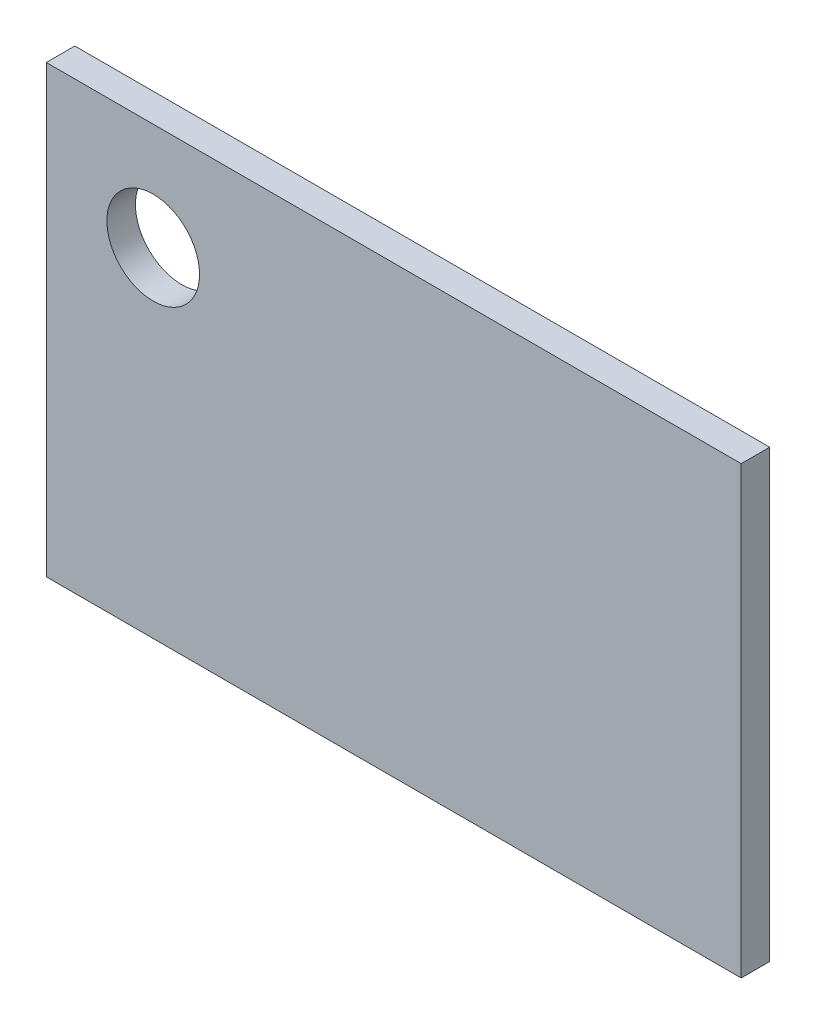
ISO-10303-21;
HEADER;
FILE_DESCRIPTION(('STEP AP214'),'2;1');
FILE_NAME('part.step','',(''),(''),'','','');
FILE_SCHEMA(('AUTOMOTIVE_DESIGN { 1 0 10303 214 1 1 1 1 }'));
ENDSEC;
DATA;
#1=APPLICATION_CONTEXT('core data for automotive mechanical design processes');
#2=APPLICATION_PROTOCOL_DEFINITION('international standard','automotive_design',2000,#1);
#3=PRODUCT_CONTEXT('',#1,'mechanical');
#4=PRODUCT('Part','Part','',(#3));
#5=PRODUCT_RELATED_PRODUCT_CATEGORY('part','',(#4));
#6=PRODUCT_DEFINITION_FORMATION('','',#4);
#7=PRODUCT_DEFINITION_CONTEXT('part definition',#1,'design');
#8=PRODUCT_DEFINITION('design','',#6,#7);
#9=PRODUCT_DEFINITION_SHAPE('','',#8);
#10=(LENGTH_UNIT() NAMED_UNIT(*) SI_UNIT(.MILLI.,.METRE.));
#11=(NAMED_UNIT(*) PLANE_ANGLE_UNIT() SI_UNIT($,.RADIAN.));
#12=(NAMED_UNIT(*) SI_UNIT($,.STERADIAN.) SOLID_ANGLE_UNIT());
#13=UNCERTAINTY_MEASURE_WITH_UNIT(LENGTH_MEASURE(1.E-05),#10,'distance_accuracy_value','');
#14=(GEOMETRIC_REPRESENTATION_CONTEXT(3) GLOBAL_UNCERTAINTY_ASSIGNED_CONTEXT((#13)) GLOBAL_UNIT_ASSIGNED_CONTEXT((#10,
#11,#12)) REPRESENTATION_CONTEXT('',''));
#15=CARTESIAN_POINT('',(0.,0.,0.));
#16=DIRECTION('',(0.,0.,1.));
#17=DIRECTION('',(1.,0.,0.));
#18=AXIS2_PLACEMENT_3D('',#15,#16,#17);
#19=CARTESIAN_POINT('',(-9.75000000000001,-6.25,0.8));
#20=DIRECTION('',(1.,0.,0.));
#21=DIRECTION('',(0.,0.,-1.));
#22=AXIS2_PLACEMENT_3D('',#19,#20,#21);
#23=PLANE('',#22);
#24=DIRECTION('',(0.,-1.,0.));
#25=VECTOR('',#24,1.);
#26=CARTESIAN_POINT('',(-9.75000000000001,-6.25,0.));
#27=LINE('',#26,#25);
#28=CARTESIAN_POINT('',(-9.75000000000001,6.25,0.));
#29=VERTEX_POINT('',#28);
#30=CARTESIAN_POINT('',(-9.75000000000001,-6.25,0.));
#31=VERTEX_POINT('',#30);
#32=EDGE_CURVE('E96',#29,#31,#27,.T.);
#33=ORIENTED_EDGE('',*,*,#32,.T.);
#34=DIRECTION('',(0.,0.,-1.));
#35=VECTOR('',#34,1.);
#36=CARTESIAN_POINT('',(-9.75000000000001,-6.25,0.8));
#37=LINE('',#36,#35);
#38=CARTESIAN_POINT('',(-9.75000000000001,-6.25,0.8));
#39=VERTEX_POINT('',#38);
#40=EDGE_CURVE('E11',#39,#31,#37,.T.);
#41=ORIENTED_EDGE('',*,*,#40,.F.);
#42=DIRECTION('',(0.,-1.,0.));
#43=VECTOR('',#42,1.);
#44=CARTESIAN_POINT('',(-9.75000000000001,-6.25,0.8));
#45=LINE('',#44,#43);
#46=CARTESIAN_POINT('',(-9.75000000000001,6.25,0.8));
#47=VERTEX_POINT('',#46);
#48=EDGE_CURVE('E84',#47,#39,#45,.T.);
#49=ORIENTED_EDGE('',*,*,#48,.F.);
#50=DIRECTION('',(0.,0.,-1.));
#51=VECTOR('',#50,1.);
#52=CARTESIAN_POINT('',(-9.75000000000001,6.25,0.8));
#53=LINE('',#52,#51);
#54=EDGE_CURVE('E92',#47,#29,#53,.T.);
#55=ORIENTED_EDGE('',*,*,#54,.T.);
#56=EDGE_LOOP('',(#33,#41,#49,#55));
#57=FACE_BOUND('',#56,.T.);
#58=ADVANCED_FACE('F33',(#57),#23,.F.);
#59=CARTESIAN_POINT('',(9.74999999999999,-6.25,0.8));
#60=DIRECTION('',(0.,1.,0.));
#61=DIRECTION('',(-1.,0.,0.));
#62=AXIS2_PLACEMENT_3D('',#59,#60,#61);
#63=PLANE('',#62);
#64=DIRECTION('',(1.,0.,0.));
#65=VECTOR('',#64,1.);
#66=CARTESIAN_POINT('',(9.74999999999999,-6.25,0.));
#67=LINE('',#66,#65);
#68=CARTESIAN_POINT('',(9.74999999999999,-6.25,0.));
#69=VERTEX_POINT('',#68);
#70=EDGE_CURVE('E88',#31,#69,#67,.T.);
#71=ORIENTED_EDGE('',*,*,#70,.T.);
#72=DIRECTION('',(0.,0.,-1.));
#73=VECTOR('',#72,1.);
#74=CARTESIAN_POINT('',(9.74999999999999,-6.25,0.8));
#75=LINE('',#74,#73);
#76=CARTESIAN_POINT('',(9.74999999999999,-6.25,0.8));
#77=VERTEX_POINT('',#76);
#78=EDGE_CURVE('E41',#77,#69,#75,.T.);
#79=ORIENTED_EDGE('',*,*,#78,.F.);
#80=DIRECTION('',(1.,0.,0.));
#81=VECTOR('',#80,1.);
#82=CARTESIAN_POINT('',(9.74999999999999,-6.25,0.8));
#83=LINE('',#82,#81);
#84=EDGE_CURVE('E79',#39,#77,#83,.T.);
#85=ORIENTED_EDGE('',*,*,#84,.F.);
#86=ORIENTED_EDGE('',*,*,#40,.T.);
#87=EDGE_LOOP('',(#71,#79,#85,#86));
#88=FACE_BOUND('',#87,.T.);
#89=ADVANCED_FACE('F87',(#88),#63,.F.);
#90=CARTESIAN_POINT('',(9.74999999999999,-6.25,0.8));
#91=DIRECTION('',(-1.,0.,0.));
#92=DIRECTION('',(0.,0.,1.));
#93=AXIS2_PLACEMENT_3D('',#90,#91,#92);
#94=PLANE('',#93);
#95=DIRECTION('',(0.,1.,0.));
#96=VECTOR('',#95,1.);
#97=CARTESIAN_POINT('',(9.74999999999999,-6.25,0.));
#98=LINE('',#97,#96);
#99=CARTESIAN_POINT('',(9.74999999999999,6.25,0.));
#100=VERTEX_POINT('',#99);
#101=EDGE_CURVE('E66',#69,#100,#98,.T.);
#102=ORIENTED_EDGE('',*,*,#101,.T.);
#103=DIRECTION('',(0.,0.,-1.));
#104=VECTOR('',#103,1.);
#105=CARTESIAN_POINT('',(9.74999999999999,6.25,0.8));
#106=LINE('',#105,#104);
#107=CARTESIAN_POINT('',(9.74999999999999,6.25,0.8));
#108=VERTEX_POINT('',#107);
#109=EDGE_CURVE('E89',#108,#100,#106,.T.);
#110=ORIENTED_EDGE('',*,*,#109,.F.);
#111=DIRECTION('',(0.,1.,0.));
#112=VECTOR('',#111,1.);
#113=CARTESIAN_POINT('',(9.74999999999999,-6.25,0.8));
#114=LINE('',#113,#112);
#115=EDGE_CURVE('E82',#77,#108,#114,.T.);
#116=ORIENTED_EDGE('',*,*,#115,.F.);
#117=ORIENTED_EDGE('',*,*,#78,.T.);
#118=EDGE_LOOP('',(#102,#110,#116,#117));
#119=FACE_BOUND('',#118,.T.);
#120=ADVANCED_FACE('F90',(#119),#94,.F.);
#121=CARTESIAN_POINT('',(9.74999999999999,6.25,0.8));
#122=DIRECTION('',(0.,-1.,0.));
#123=DIRECTION('',(1.,0.,0.));
#124=AXIS2_PLACEMENT_3D('',#121,#122,#123);
#125=PLANE('',#124);
#126=DIRECTION('',(-1.,0.,0.));
#127=VECTOR('',#126,1.);
#128=CARTESIAN_POINT('',(9.74999999999999,6.25,0.));
#129=LINE('',#128,#127);
#130=EDGE_CURVE('E72',#100,#29,#129,.T.);
#131=ORIENTED_EDGE('',*,*,#130,.T.);
#132=ORIENTED_EDGE('',*,*,#54,.F.);
#133=DIRECTION('',(-1.,0.,0.));
#134=VECTOR('',#133,1.);
#135=CARTESIAN_POINT('',(9.74999999999999,6.25,0.8));
#136=LINE('',#135,#134);
#137=EDGE_CURVE('E49',#108,#47,#136,.T.);
#138=ORIENTED_EDGE('',*,*,#137,.F.);
#139=ORIENTED_EDGE('',*,*,#109,.T.);
#140=EDGE_LOOP('',(#131,#132,#138,#139));
#141=FACE_BOUND('',#140,.T.);
#142=ADVANCED_FACE('F104',(#141),#125,.F.);
#143=CARTESIAN_POINT('',(0.,0.,0.8));
#144=DIRECTION('',(0.,0.,1.));
#145=DIRECTION('',(1.,0.,0.));
#146=AXIS2_PLACEMENT_3D('',#143,#144,#145);
#147=PLANE('',#146);
#148=CARTESIAN_POINT('',(-6.75000000000001,3.25,0.8));
#149=DIRECTION('',(0.,0.,1.));
#150=DIRECTION('',(1.,0.,0.));
#151=AXIS2_PLACEMENT_3D('',#148,#149,#150);
#152=CIRCLE('',#151,1.3);
#153=CARTESIAN_POINT('',(-5.45000000000001,3.25,0.8));
#154=VERTEX_POINT('',#153);
#155=EDGE_CURVE('E110',#154,#154,#152,.T.);
#156=ORIENTED_EDGE('',*,*,#155,.F.);
#157=EDGE_LOOP('',(#156));
#158=FACE_BOUND('',#157,.T.);
#159=ORIENTED_EDGE('',*,*,#48,.T.);
#160=ORIENTED_EDGE('',*,*,#84,.T.);
#161=ORIENTED_EDGE('',*,*,#115,.T.);
#162=ORIENTED_EDGE('',*,*,#137,.T.);
#163=EDGE_LOOP('',(#159,#160,#161,#162));
#164=FACE_BOUND('',#163,.T.);
#165=ADVANCED_FACE('F80',(#158,#164),#147,.T.);
#166=CARTESIAN_POINT('',(0.,0.,0.));
#167=DIRECTION('',(0.,0.,1.));
#168=DIRECTION('',(1.,0.,0.));
#169=AXIS2_PLACEMENT_3D('',#166,#167,#168);
#170=PLANE('',#169);
#171=CARTESIAN_POINT('',(-6.75000000000001,3.25,0.));
#172=DIRECTION('',(0.,0.,1.));
#173=DIRECTION('',(1.,0.,0.));
#174=AXIS2_PLACEMENT_3D('',#171,#172,#173);
#175=CIRCLE('',#174,1.3);
#176=CARTESIAN_POINT('',(-5.45000000000001,3.25,0.));
#177=VERTEX_POINT('',#176);
#178=EDGE_CURVE('E99',#177,#177,#175,.T.);
#179=ORIENTED_EDGE('',*,*,#178,.T.);
#180=EDGE_LOOP('',(#179));
#181=FACE_BOUND('',#180,.T.);
#182=ORIENTED_EDGE('',*,*,#32,.F.);
#183=ORIENTED_EDGE('',*,*,#130,.F.);
#184=ORIENTED_EDGE('',*,*,#101,.F.);
#185=ORIENTED_EDGE('',*,*,#70,.F.);
#186=EDGE_LOOP('',(#182,#183,#184,#185));
#187=FACE_BOUND('',#186,.T.);
#188=ADVANCED_FACE('F107',(#181,#187),#170,.F.);
#189=CARTESIAN_POINT('',(-6.75000000000001,3.25,0.));
#190=DIRECTION('',(0.,0.,1.));
#191=DIRECTION('',(1.,0.,0.));
#192=AXIS2_PLACEMENT_3D('',#189,#190,#191);
#193=CYLINDRICAL_SURFACE('',#192,1.3);
#194=ORIENTED_EDGE('',*,*,#178,.F.);
#195=EDGE_LOOP('',(#194));
#196=FACE_BOUND('',#195,.T.);
#197=ORIENTED_EDGE('',*,*,#155,.T.);
#198=EDGE_LOOP('',(#197));
#199=FACE_BOUND('',#198,.T.);
#200=ADVANCED_FACE('F117',(#196,#199),#193,.F.);
#201=CLOSED_SHELL('',(#58,#89,#120,#142,#165,#188,#200));
#202=MANIFOLD_SOLID_BREP('B2',#201);
#203=ADVANCED_BREP_SHAPE_REPRESENTATION('',(#18,#202),#14);
#204=SHAPE_DEFINITION_REPRESENTATION(#9,#203);
ENDSEC;
END-ISO-10303-21;
